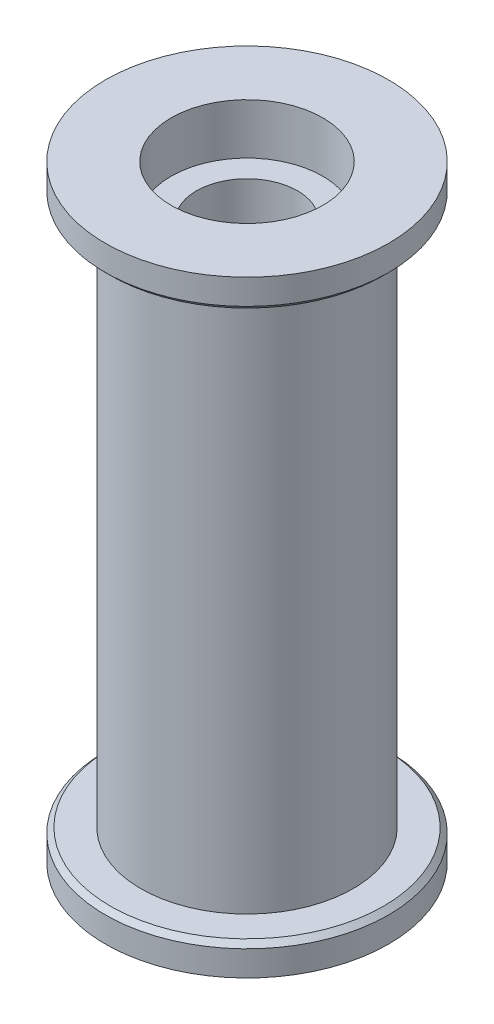
ISO-10303-21;
HEADER;
FILE_DESCRIPTION(('STEP AP214'),'2;1');
FILE_NAME('part.step','',(''),(''),'','','');
FILE_SCHEMA(('AUTOMOTIVE_DESIGN { 1 0 10303 214 1 1 1 1 }'));
ENDSEC;
DATA;
#1=APPLICATION_CONTEXT('core data for automotive mechanical design processes');
#2=APPLICATION_PROTOCOL_DEFINITION('international standard','automotive_design',2000,#1);
#3=PRODUCT_CONTEXT('',#1,'mechanical');
#4=PRODUCT('Part','Part','',(#3));
#5=PRODUCT_RELATED_PRODUCT_CATEGORY('part','',(#4));
#6=PRODUCT_DEFINITION_FORMATION('','',#4);
#7=PRODUCT_DEFINITION_CONTEXT('part definition',#1,'design');
#8=PRODUCT_DEFINITION('design','',#6,#7);
#9=PRODUCT_DEFINITION_SHAPE('','',#8);
#10=(LENGTH_UNIT() NAMED_UNIT(*) SI_UNIT(.MILLI.,.METRE.));
#11=(NAMED_UNIT(*) PLANE_ANGLE_UNIT() SI_UNIT($,.RADIAN.));
#12=(NAMED_UNIT(*) SI_UNIT($,.STERADIAN.) SOLID_ANGLE_UNIT());
#13=UNCERTAINTY_MEASURE_WITH_UNIT(LENGTH_MEASURE(1.E-05),#10,'distance_accuracy_value','');
#14=(GEOMETRIC_REPRESENTATION_CONTEXT(3) GLOBAL_UNCERTAINTY_ASSIGNED_CONTEXT((#13)) GLOBAL_UNIT_ASSIGNED_CONTEXT((#10,
#11,#12)) REPRESENTATION_CONTEXT('',''));
#15=CARTESIAN_POINT('',(0.,0.,0.));
#16=DIRECTION('',(0.,0.,1.));
#17=DIRECTION('',(1.,0.,0.));
#18=AXIS2_PLACEMENT_3D('',#15,#16,#17);
#19=CARTESIAN_POINT('',(0.,-55.,0.));
#20=DIRECTION('',(0.,1.,0.));
#21=DIRECTION('',(-1.,0.,0.));
#22=AXIS2_PLACEMENT_3D('',#19,#20,#21);
#23=PLANE('',#22);
#24=CARTESIAN_POINT('',(0.,-55.,0.));
#25=DIRECTION('',(0.,1.,0.));
#26=DIRECTION('',(-1.,0.,0.));
#27=AXIS2_PLACEMENT_3D('',#24,#25,#26);
#28=CIRCLE('',#27,7.5);
#29=CARTESIAN_POINT('',(-7.49999999999999,-55.,0.));
#30=VERTEX_POINT('',#29);
#31=EDGE_CURVE('E66',#30,#30,#28,.T.);
#32=ORIENTED_EDGE('',*,*,#31,.F.);
#33=EDGE_LOOP('',(#32));
#34=FACE_BOUND('',#33,.T.);
#35=CARTESIAN_POINT('',(0.,-55.,0.));
#36=DIRECTION('',(0.,1.,0.));
#37=DIRECTION('',(-1.,0.,0.));
#38=AXIS2_PLACEMENT_3D('',#35,#36,#37);
#39=CIRCLE('',#38,5.);
#40=CARTESIAN_POINT('',(-4.99999999999999,-55.,0.));
#41=VERTEX_POINT('',#40);
#42=EDGE_CURVE('E102',#41,#41,#39,.T.);
#43=ORIENTED_EDGE('',*,*,#42,.T.);
#44=EDGE_LOOP('',(#43));
#45=FACE_BOUND('',#44,.T.);
#46=ADVANCED_FACE('F41',(#34,#45),#23,.F.);
#47=CARTESIAN_POINT('',(0.,0.,0.));
#48=DIRECTION('',(0.,1.,0.));
#49=DIRECTION('',(-1.,0.,0.));
#50=AXIS2_PLACEMENT_3D('',#47,#48,#49);
#51=CYLINDRICAL_SURFACE('',#50,7.5);
#52=CARTESIAN_POINT('',(0.,-60.,0.));
#53=DIRECTION('',(0.,1.,0.));
#54=DIRECTION('',(-1.,0.,0.));
#55=AXIS2_PLACEMENT_3D('',#52,#53,#54);
#56=CIRCLE('',#55,7.5);
#57=CARTESIAN_POINT('',(-7.49999999999999,-60.,0.));
#58=VERTEX_POINT('',#57);
#59=EDGE_CURVE('E70',#58,#58,#56,.T.);
#60=ORIENTED_EDGE('',*,*,#59,.F.);
#61=EDGE_LOOP('',(#60));
#62=FACE_BOUND('',#61,.T.);
#63=ORIENTED_EDGE('',*,*,#31,.T.);
#64=EDGE_LOOP('',(#63));
#65=FACE_BOUND('',#64,.T.);
#66=ADVANCED_FACE('F143',(#62,#65),#51,.F.);
#67=CARTESIAN_POINT('',(0.,-60.,0.));
#68=DIRECTION('',(0.,1.,0.));
#69=DIRECTION('',(-1.,0.,0.));
#70=AXIS2_PLACEMENT_3D('',#67,#68,#69);
#71=PLANE('',#70);
#72=CARTESIAN_POINT('',(0.,-60.,0.));
#73=DIRECTION('',(0.,1.,0.));
#74=DIRECTION('',(-1.,0.,0.));
#75=AXIS2_PLACEMENT_3D('',#72,#73,#74);
#76=CIRCLE('',#75,14.);
#77=CARTESIAN_POINT('',(-14.,-60.,0.));
#78=VERTEX_POINT('',#77);
#79=EDGE_CURVE('E74',#78,#78,#76,.T.);
#80=ORIENTED_EDGE('',*,*,#79,.F.);
#81=EDGE_LOOP('',(#80));
#82=FACE_BOUND('',#81,.T.);
#83=ORIENTED_EDGE('',*,*,#59,.T.);
#84=EDGE_LOOP('',(#83));
#85=FACE_BOUND('',#84,.T.);
#86=ADVANCED_FACE('F149',(#82,#85),#71,.F.);
#87=CARTESIAN_POINT('',(0.,0.,0.));
#88=DIRECTION('',(0.,1.,0.));
#89=DIRECTION('',(-1.,0.,0.));
#90=AXIS2_PLACEMENT_3D('',#87,#88,#89);
#91=CYLINDRICAL_SURFACE('',#90,14.);
#92=CARTESIAN_POINT('',(0.,-57.5,0.));
#93=DIRECTION('',(0.,-1.,0.));
#94=DIRECTION('',(1.,0.,0.));
#95=AXIS2_PLACEMENT_3D('',#92,#93,#94);
#96=CIRCLE('',#95,14.);
#97=CARTESIAN_POINT('',(14.,-57.5,0.));
#98=VERTEX_POINT('',#97);
#99=EDGE_CURVE('E55',#98,#98,#96,.T.);
#100=ORIENTED_EDGE('',*,*,#99,.T.);
#101=EDGE_LOOP('',(#100));
#102=FACE_BOUND('',#101,.T.);
#103=ORIENTED_EDGE('',*,*,#79,.T.);
#104=EDGE_LOOP('',(#103));
#105=FACE_BOUND('',#104,.T.);
#106=ADVANCED_FACE('F170',(#102,#105),#91,.T.);
#107=CARTESIAN_POINT('',(0.,-57.,0.));
#108=DIRECTION('',(0.,-1.,0.));
#109=DIRECTION('',(1.,0.,0.));
#110=AXIS2_PLACEMENT_3D('',#107,#108,#109);
#111=PLANE('',#110);
#112=CARTESIAN_POINT('',(0.,-57.,0.));
#113=DIRECTION('',(0.,-1.,0.));
#114=DIRECTION('',(1.,0.,0.));
#115=AXIS2_PLACEMENT_3D('',#112,#113,#114);
#116=CIRCLE('',#115,13.5);
#117=CARTESIAN_POINT('',(13.5,-57.,0.));
#118=VERTEX_POINT('',#117);
#119=EDGE_CURVE('E60',#118,#118,#116,.F.);
#120=ORIENTED_EDGE('',*,*,#119,.T.);
#121=EDGE_LOOP('',(#120));
#122=FACE_BOUND('',#121,.T.);
#123=CARTESIAN_POINT('',(0.,-57.,0.));
#124=DIRECTION('',(0.,1.,0.));
#125=DIRECTION('',(-1.,0.,0.));
#126=AXIS2_PLACEMENT_3D('',#123,#124,#125);
#127=CIRCLE('',#126,10.5);
#128=CARTESIAN_POINT('',(-10.5,-57.,0.));
#129=VERTEX_POINT('',#128);
#130=EDGE_CURVE('E78',#129,#129,#127,.T.);
#131=ORIENTED_EDGE('',*,*,#130,.F.);
#132=EDGE_LOOP('',(#131));
#133=FACE_BOUND('',#132,.T.);
#134=ADVANCED_FACE('F167',(#122,#133),#111,.F.);
#135=CARTESIAN_POINT('',(0.,0.,0.));
#136=DIRECTION('',(0.,1.,0.));
#137=DIRECTION('',(-1.,0.,0.));
#138=AXIS2_PLACEMENT_3D('',#135,#136,#137);
#139=CYLINDRICAL_SURFACE('',#138,10.5);
#140=CARTESIAN_POINT('',(0.,-3.,0.));
#141=DIRECTION('',(0.,1.,0.));
#142=DIRECTION('',(-1.,0.,0.));
#143=AXIS2_PLACEMENT_3D('',#140,#141,#142);
#144=CIRCLE('',#143,10.5);
#145=CARTESIAN_POINT('',(-10.5,-3.,0.));
#146=VERTEX_POINT('',#145);
#147=EDGE_CURVE('E82',#146,#146,#144,.T.);
#148=ORIENTED_EDGE('',*,*,#147,.F.);
#149=EDGE_LOOP('',(#148));
#150=FACE_BOUND('',#149,.T.);
#151=ORIENTED_EDGE('',*,*,#130,.T.);
#152=EDGE_LOOP('',(#151));
#153=FACE_BOUND('',#152,.T.);
#154=ADVANCED_FACE('F140',(#150,#153),#139,.T.);
#155=CARTESIAN_POINT('',(0.,-3.,0.));
#156=DIRECTION('',(0.,1.,0.));
#157=DIRECTION('',(-1.,0.,0.));
#158=AXIS2_PLACEMENT_3D('',#155,#156,#157);
#159=PLANE('',#158);
#160=CARTESIAN_POINT('',(0.,-3.,0.));
#161=DIRECTION('',(0.,1.,0.));
#162=DIRECTION('',(-1.,0.,0.));
#163=AXIS2_PLACEMENT_3D('',#160,#161,#162);
#164=CIRCLE('',#163,13.5);
#165=CARTESIAN_POINT('',(-13.5,-3.00000000000001,0.));
#166=VERTEX_POINT('',#165);
#167=EDGE_CURVE('E10',#166,#166,#164,.F.);
#168=ORIENTED_EDGE('',*,*,#167,.T.);
#169=EDGE_LOOP('',(#168));
#170=FACE_BOUND('',#169,.T.);
#171=ORIENTED_EDGE('',*,*,#147,.T.);
#172=EDGE_LOOP('',(#171));
#173=FACE_BOUND('',#172,.T.);
#174=ADVANCED_FACE('F135',(#170,#173),#159,.F.);
#175=CARTESIAN_POINT('',(0.,0.,0.));
#176=DIRECTION('',(0.,1.,0.));
#177=DIRECTION('',(-1.,0.,0.));
#178=AXIS2_PLACEMENT_3D('',#175,#176,#177);
#179=CYLINDRICAL_SURFACE('',#178,14.);
#180=CARTESIAN_POINT('',(0.,-2.50000000000001,0.));
#181=DIRECTION('',(0.,1.,0.));
#182=DIRECTION('',(-1.,0.,0.));
#183=AXIS2_PLACEMENT_3D('',#180,#181,#182);
#184=CIRCLE('',#183,14.);
#185=CARTESIAN_POINT('',(-14.,-2.50000000000002,0.));
#186=VERTEX_POINT('',#185);
#187=EDGE_CURVE('E50',#186,#186,#184,.T.);
#188=ORIENTED_EDGE('',*,*,#187,.T.);
#189=EDGE_LOOP('',(#188));
#190=FACE_BOUND('',#189,.T.);
#191=CARTESIAN_POINT('',(0.,0.,0.));
#192=DIRECTION('',(0.,1.,0.));
#193=DIRECTION('',(-1.,0.,0.));
#194=AXIS2_PLACEMENT_3D('',#191,#192,#193);
#195=CIRCLE('',#194,14.);
#196=CARTESIAN_POINT('',(-14.,0.,0.));
#197=VERTEX_POINT('',#196);
#198=EDGE_CURVE('E86',#197,#197,#195,.T.);
#199=ORIENTED_EDGE('',*,*,#198,.F.);
#200=EDGE_LOOP('',(#199));
#201=FACE_BOUND('',#200,.T.);
#202=ADVANCED_FACE('F130',(#190,#201),#179,.T.);
#203=CARTESIAN_POINT('',(0.,0.,0.));
#204=DIRECTION('',(0.,-1.,0.));
#205=DIRECTION('',(1.,0.,0.));
#206=AXIS2_PLACEMENT_3D('',#203,#204,#205);
#207=PLANE('',#206);
#208=CARTESIAN_POINT('',(0.,0.,0.));
#209=DIRECTION('',(0.,1.,0.));
#210=DIRECTION('',(-1.,0.,0.));
#211=AXIS2_PLACEMENT_3D('',#208,#209,#210);
#212=CIRCLE('',#211,7.5);
#213=CARTESIAN_POINT('',(-7.50000000000001,0.,0.));
#214=VERTEX_POINT('',#213);
#215=EDGE_CURVE('E90',#214,#214,#212,.T.);
#216=ORIENTED_EDGE('',*,*,#215,.F.);
#217=EDGE_LOOP('',(#216));
#218=FACE_BOUND('',#217,.T.);
#219=ORIENTED_EDGE('',*,*,#198,.T.);
#220=EDGE_LOOP('',(#219));
#221=FACE_BOUND('',#220,.T.);
#222=ADVANCED_FACE('F124',(#218,#221),#207,.F.);
#223=CARTESIAN_POINT('',(0.,0.,0.));
#224=DIRECTION('',(0.,1.,0.));
#225=DIRECTION('',(-1.,0.,0.));
#226=AXIS2_PLACEMENT_3D('',#223,#224,#225);
#227=CYLINDRICAL_SURFACE('',#226,7.5);
#228=CARTESIAN_POINT('',(0.,-5.00000000000001,0.));
#229=DIRECTION('',(0.,1.,0.));
#230=DIRECTION('',(-1.,0.,0.));
#231=AXIS2_PLACEMENT_3D('',#228,#229,#230);
#232=CIRCLE('',#231,7.5);
#233=CARTESIAN_POINT('',(-7.5,-5.00000000000001,0.));
#234=VERTEX_POINT('',#233);
#235=EDGE_CURVE('E94',#234,#234,#232,.T.);
#236=ORIENTED_EDGE('',*,*,#235,.F.);
#237=EDGE_LOOP('',(#236));
#238=FACE_BOUND('',#237,.T.);
#239=ORIENTED_EDGE('',*,*,#215,.T.);
#240=EDGE_LOOP('',(#239));
#241=FACE_BOUND('',#240,.T.);
#242=ADVANCED_FACE('F118',(#238,#241),#227,.F.);
#243=CARTESIAN_POINT('',(0.,-5.00000000000001,0.));
#244=DIRECTION('',(0.,-1.,0.));
#245=DIRECTION('',(1.,0.,0.));
#246=AXIS2_PLACEMENT_3D('',#243,#244,#245);
#247=PLANE('',#246);
#248=CARTESIAN_POINT('',(0.,-5.00000000000001,0.));
#249=DIRECTION('',(0.,1.,0.));
#250=DIRECTION('',(-1.,0.,0.));
#251=AXIS2_PLACEMENT_3D('',#248,#249,#250);
#252=CIRCLE('',#251,5.);
#253=CARTESIAN_POINT('',(-5.,-5.00000000000001,0.));
#254=VERTEX_POINT('',#253);
#255=EDGE_CURVE('E98',#254,#254,#252,.T.);
#256=ORIENTED_EDGE('',*,*,#255,.F.);
#257=EDGE_LOOP('',(#256));
#258=FACE_BOUND('',#257,.T.);
#259=ORIENTED_EDGE('',*,*,#235,.T.);
#260=EDGE_LOOP('',(#259));
#261=FACE_BOUND('',#260,.T.);
#262=ADVANCED_FACE('F112',(#258,#261),#247,.F.);
#263=CARTESIAN_POINT('',(0.,0.,0.));
#264=DIRECTION('',(0.,1.,0.));
#265=DIRECTION('',(-1.,0.,0.));
#266=AXIS2_PLACEMENT_3D('',#263,#264,#265);
#267=CYLINDRICAL_SURFACE('',#266,5.);
#268=ORIENTED_EDGE('',*,*,#42,.F.);
#269=EDGE_LOOP('',(#268));
#270=FACE_BOUND('',#269,.T.);
#271=ORIENTED_EDGE('',*,*,#255,.T.);
#272=EDGE_LOOP('',(#271));
#273=FACE_BOUND('',#272,.T.);
#274=ADVANCED_FACE('F108',(#270,#273),#267,.F.);
#275=CARTESIAN_POINT('',(0.,-57.,0.));
#276=DIRECTION('',(0.,-1.,0.));
#277=DIRECTION('',(1.,0.,0.));
#278=AXIS2_PLACEMENT_3D('',#275,#276,#277);
#279=CONICAL_SURFACE('',#278,13.5,0.785398163397448);
#280=ORIENTED_EDGE('',*,*,#99,.F.);
#281=EDGE_LOOP('',(#280));
#282=FACE_BOUND('',#281,.T.);
#283=ORIENTED_EDGE('',*,*,#119,.F.);
#284=EDGE_LOOP('',(#283));
#285=FACE_BOUND('',#284,.T.);
#286=ADVANCED_FACE('F111',(#282,#285),#279,.T.);
#287=CARTESIAN_POINT('',(0.,-2.50000000000001,0.));
#288=DIRECTION('',(0.,1.,0.));
#289=DIRECTION('',(-1.,0.,0.));
#290=AXIS2_PLACEMENT_3D('',#287,#288,#289);
#291=CONICAL_SURFACE('',#290,14.,0.785398163397455);
#292=ORIENTED_EDGE('',*,*,#167,.F.);
#293=EDGE_LOOP('',(#292));
#294=FACE_BOUND('',#293,.T.);
#295=ORIENTED_EDGE('',*,*,#187,.F.);
#296=EDGE_LOOP('',(#295));
#297=FACE_BOUND('',#296,.T.);
#298=ADVANCED_FACE('F44',(#294,#297),#291,.T.);
#299=CLOSED_SHELL('',(#46,#66,#86,#106,#134,#154,#174,#202,#222,#242,#262,#274,#286,#298));
#300=MANIFOLD_SOLID_BREP('B2',#299);
#301=ADVANCED_BREP_SHAPE_REPRESENTATION('',(#18,#300),#14);
#302=SHAPE_DEFINITION_REPRESENTATION(#9,#301);
ENDSEC;
END-ISO-10303-21;
